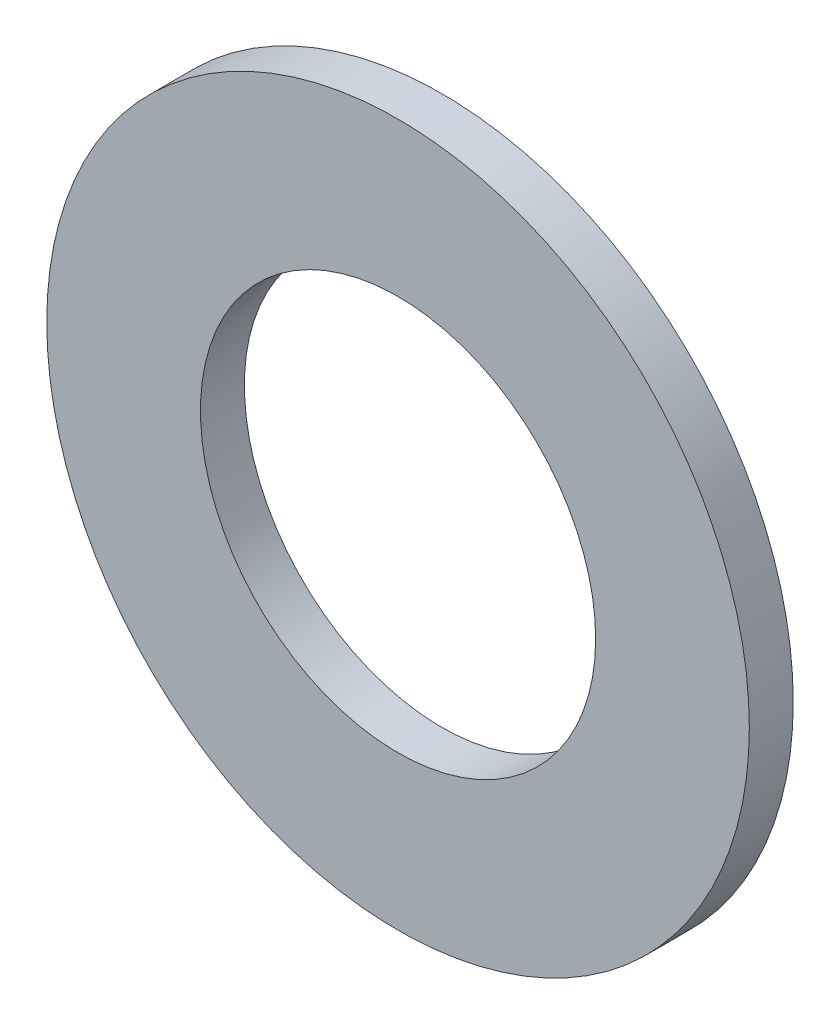
ISO-10303-21;
HEADER;
FILE_DESCRIPTION(('STEP AP214'),'2;1');
FILE_NAME('part.step','',(''),(''),'','','');
FILE_SCHEMA(('AUTOMOTIVE_DESIGN { 1 0 10303 214 1 1 1 1 }'));
ENDSEC;
DATA;
#1=APPLICATION_CONTEXT('core data for automotive mechanical design processes');
#2=APPLICATION_PROTOCOL_DEFINITION('international standard','automotive_design',2000,#1);
#3=PRODUCT_CONTEXT('',#1,'mechanical');
#4=PRODUCT('Part','Part','',(#3));
#5=PRODUCT_RELATED_PRODUCT_CATEGORY('part','',(#4));
#6=PRODUCT_DEFINITION_FORMATION('','',#4);
#7=PRODUCT_DEFINITION_CONTEXT('part definition',#1,'design');
#8=PRODUCT_DEFINITION('design','',#6,#7);
#9=PRODUCT_DEFINITION_SHAPE('','',#8);
#10=(LENGTH_UNIT() NAMED_UNIT(*) SI_UNIT(.MILLI.,.METRE.));
#11=(NAMED_UNIT(*) PLANE_ANGLE_UNIT() SI_UNIT($,.RADIAN.));
#12=(NAMED_UNIT(*) SI_UNIT($,.STERADIAN.) SOLID_ANGLE_UNIT());
#13=UNCERTAINTY_MEASURE_WITH_UNIT(LENGTH_MEASURE(1.E-05),#10,'distance_accuracy_value','');
#14=(GEOMETRIC_REPRESENTATION_CONTEXT(3) GLOBAL_UNCERTAINTY_ASSIGNED_CONTEXT((#13)) GLOBAL_UNIT_ASSIGNED_CONTEXT((#10,
#11,#12)) REPRESENTATION_CONTEXT('',''));
#15=CARTESIAN_POINT('',(0.,0.,0.));
#16=DIRECTION('',(0.,0.,1.));
#17=DIRECTION('',(1.,0.,0.));
#18=AXIS2_PLACEMENT_3D('',#15,#16,#17);
#19=CARTESIAN_POINT('',(0.,0.,1.));
#20=DIRECTION('',(0.,0.,1.));
#21=DIRECTION('',(1.,0.,0.));
#22=AXIS2_PLACEMENT_3D('',#19,#20,#21);
#23=PLANE('',#22);
#24=CARTESIAN_POINT('',(0.,0.,1.));
#25=DIRECTION('',(0.,0.,1.));
#26=DIRECTION('',(1.,0.,0.));
#27=AXIS2_PLACEMENT_3D('',#24,#25,#26);
#28=CIRCLE('',#27,8.);
#29=CARTESIAN_POINT('',(8.,0.,1.));
#30=VERTEX_POINT('',#29);
#31=EDGE_CURVE('E10',#30,#30,#28,.T.);
#32=ORIENTED_EDGE('',*,*,#31,.T.);
#33=EDGE_LOOP('',(#32));
#34=FACE_BOUND('',#33,.T.);
#35=CARTESIAN_POINT('',(0.,0.,1.));
#36=DIRECTION('',(0.,0.,1.));
#37=DIRECTION('',(1.,0.,0.));
#38=AXIS2_PLACEMENT_3D('',#35,#36,#37);
#39=CIRCLE('',#38,4.5);
#40=CARTESIAN_POINT('',(4.5,0.,1.));
#41=VERTEX_POINT('',#40);
#42=EDGE_CURVE('E46',#41,#41,#39,.T.);
#43=ORIENTED_EDGE('',*,*,#42,.F.);
#44=EDGE_LOOP('',(#43));
#45=FACE_BOUND('',#44,.T.);
#46=ADVANCED_FACE('F35',(#34,#45),#23,.T.);
#47=CARTESIAN_POINT('',(0.,0.,0.));
#48=DIRECTION('',(0.,0.,1.));
#49=DIRECTION('',(1.,0.,0.));
#50=AXIS2_PLACEMENT_3D('',#47,#48,#49);
#51=PLANE('',#50);
#52=CARTESIAN_POINT('',(0.,0.,0.));
#53=DIRECTION('',(0.,0.,1.));
#54=DIRECTION('',(1.,0.,0.));
#55=AXIS2_PLACEMENT_3D('',#52,#53,#54);
#56=CIRCLE('',#55,8.);
#57=CARTESIAN_POINT('',(8.,0.,0.));
#58=VERTEX_POINT('',#57);
#59=EDGE_CURVE('E39',#58,#58,#56,.T.);
#60=ORIENTED_EDGE('',*,*,#59,.F.);
#61=EDGE_LOOP('',(#60));
#62=FACE_BOUND('',#61,.T.);
#63=CARTESIAN_POINT('',(0.,0.,0.));
#64=DIRECTION('',(0.,0.,1.));
#65=DIRECTION('',(1.,0.,0.));
#66=AXIS2_PLACEMENT_3D('',#63,#64,#65);
#67=CIRCLE('',#66,4.5);
#68=CARTESIAN_POINT('',(4.5,0.,0.));
#69=VERTEX_POINT('',#68);
#70=EDGE_CURVE('E48',#69,#69,#67,.T.);
#71=ORIENTED_EDGE('',*,*,#70,.T.);
#72=EDGE_LOOP('',(#71));
#73=FACE_BOUND('',#72,.T.);
#74=ADVANCED_FACE('F58',(#62,#73),#51,.F.);
#75=CARTESIAN_POINT('',(0.,0.,1.));
#76=DIRECTION('',(0.,0.,-1.));
#77=DIRECTION('',(-1.,0.,0.));
#78=AXIS2_PLACEMENT_3D('',#75,#76,#77);
#79=CYLINDRICAL_SURFACE('',#78,8.);
#80=ORIENTED_EDGE('',*,*,#31,.F.);
#81=EDGE_LOOP('',(#80));
#82=FACE_BOUND('',#81,.T.);
#83=ORIENTED_EDGE('',*,*,#59,.T.);
#84=EDGE_LOOP('',(#83));
#85=FACE_BOUND('',#84,.T.);
#86=ADVANCED_FACE('F37',(#82,#85),#79,.T.);
#87=CARTESIAN_POINT('',(0.,0.,1.));
#88=DIRECTION('',(0.,0.,-1.));
#89=DIRECTION('',(-1.,0.,0.));
#90=AXIS2_PLACEMENT_3D('',#87,#88,#89);
#91=CYLINDRICAL_SURFACE('',#90,4.5);
#92=ORIENTED_EDGE('',*,*,#42,.T.);
#93=EDGE_LOOP('',(#92));
#94=FACE_BOUND('',#93,.T.);
#95=ORIENTED_EDGE('',*,*,#70,.F.);
#96=EDGE_LOOP('',(#95));
#97=FACE_BOUND('',#96,.T.);
#98=ADVANCED_FACE('F54',(#94,#97),#91,.F.);
#99=CLOSED_SHELL('',(#46,#74,#86,#98));
#100=MANIFOLD_SOLID_BREP('B2',#99);
#101=ADVANCED_BREP_SHAPE_REPRESENTATION('',(#18,#100),#14);
#102=SHAPE_DEFINITION_REPRESENTATION(#9,#101);
ENDSEC;
END-ISO-10303-21;
